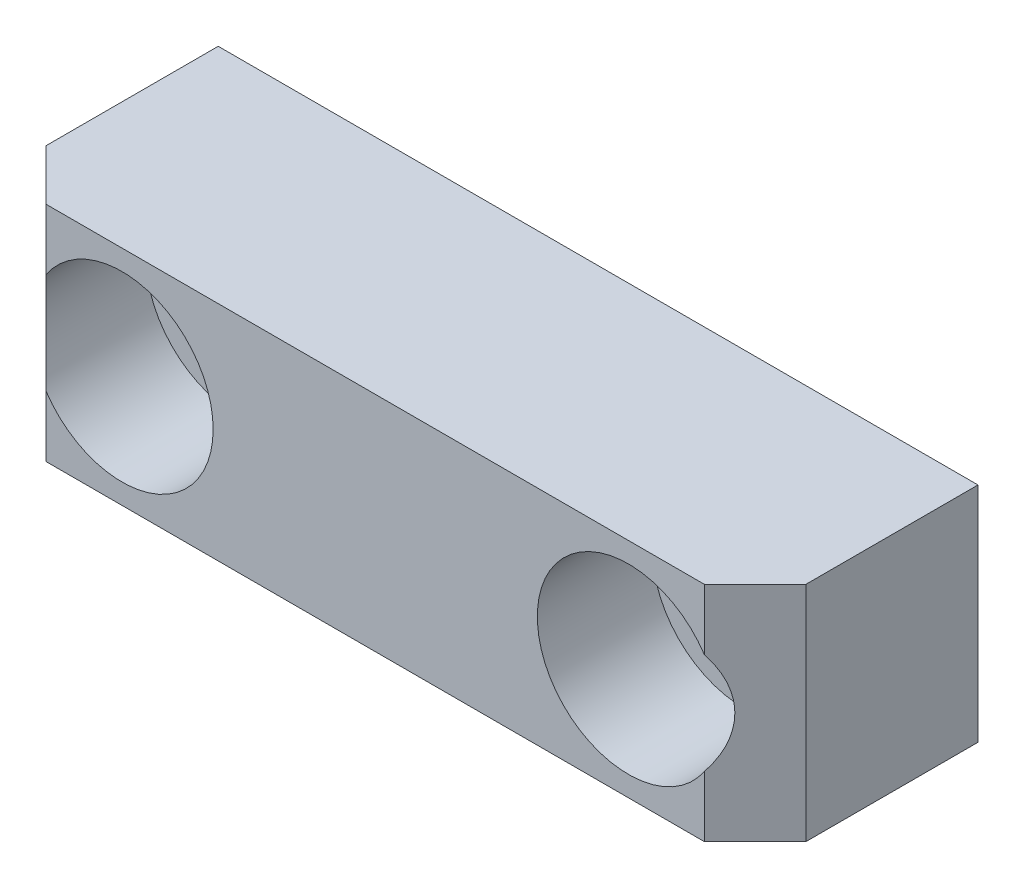
ISO-10303-21;
HEADER;
FILE_DESCRIPTION(('STEP AP214'),'2;1');
FILE_NAME('part.step','',(''),(''),'','','');
FILE_SCHEMA(('AUTOMOTIVE_DESIGN { 1 0 10303 214 1 1 1 1 }'));
ENDSEC;
DATA;
#1=APPLICATION_CONTEXT('core data for automotive mechanical design processes');
#2=APPLICATION_PROTOCOL_DEFINITION('international standard','automotive_design',2000,#1);
#3=PRODUCT_CONTEXT('',#1,'mechanical');
#4=PRODUCT('Part','Part','',(#3));
#5=PRODUCT_RELATED_PRODUCT_CATEGORY('part','',(#4));
#6=PRODUCT_DEFINITION_FORMATION('','',#4);
#7=PRODUCT_DEFINITION_CONTEXT('part definition',#1,'design');
#8=PRODUCT_DEFINITION('design','',#6,#7);
#9=PRODUCT_DEFINITION_SHAPE('','',#8);
#10=(LENGTH_UNIT() NAMED_UNIT(*) SI_UNIT(.MILLI.,.METRE.));
#11=(NAMED_UNIT(*) PLANE_ANGLE_UNIT() SI_UNIT($,.RADIAN.));
#12=(NAMED_UNIT(*) SI_UNIT($,.STERADIAN.) SOLID_ANGLE_UNIT());
#13=UNCERTAINTY_MEASURE_WITH_UNIT(LENGTH_MEASURE(1.E-05),#10,'distance_accuracy_value','');
#14=(GEOMETRIC_REPRESENTATION_CONTEXT(3) GLOBAL_UNCERTAINTY_ASSIGNED_CONTEXT((#13)) GLOBAL_UNIT_ASSIGNED_CONTEXT((#10,
#11,#12)) REPRESENTATION_CONTEXT('',''));
#15=CARTESIAN_POINT('',(0.,0.,0.));
#16=DIRECTION('',(0.,0.,1.));
#17=DIRECTION('',(1.,0.,0.));
#18=AXIS2_PLACEMENT_3D('',#15,#16,#17);
#19=CARTESIAN_POINT('',(-37.5,22.,0.));
#20=DIRECTION('',(1.,0.,0.));
#21=DIRECTION('',(0.,0.,-1.));
#22=AXIS2_PLACEMENT_3D('',#19,#20,#21);
#23=PLANE('',#22);
#24=DIRECTION('',(0.,0.,1.));
#25=VECTOR('',#24,1.);
#26=CARTESIAN_POINT('',(-37.5,0.,0.));
#27=LINE('',#26,#25);
#28=CARTESIAN_POINT('',(-37.5,0.,-22.));
#29=VERTEX_POINT('',#28);
#30=CARTESIAN_POINT('',(-37.5,0.,-5.00000000000004));
#31=VERTEX_POINT('',#30);
#32=EDGE_CURVE('E123',#29,#31,#27,.T.);
#33=ORIENTED_EDGE('',*,*,#32,.T.);
#34=DIRECTION('',(0.,1.,0.));
#35=VECTOR('',#34,1.);
#36=CARTESIAN_POINT('',(-37.5,22.,-5.00000000000004));
#37=LINE('',#36,#35);
#38=CARTESIAN_POINT('',(-37.5,22.,-5.00000000000004));
#39=VERTEX_POINT('',#38);
#40=EDGE_CURVE('E55',#31,#39,#37,.T.);
#41=ORIENTED_EDGE('',*,*,#40,.T.);
#42=DIRECTION('',(0.,0.,1.));
#43=VECTOR('',#42,1.);
#44=CARTESIAN_POINT('',(-37.5,22.,0.));
#45=LINE('',#44,#43);
#46=CARTESIAN_POINT('',(-37.5,22.,-22.));
#47=VERTEX_POINT('',#46);
#48=EDGE_CURVE('E131',#47,#39,#45,.T.);
#49=ORIENTED_EDGE('',*,*,#48,.F.);
#50=DIRECTION('',(0.,-1.,0.));
#51=VECTOR('',#50,1.);
#52=CARTESIAN_POINT('',(-37.5,22.,-22.));
#53=LINE('',#52,#51);
#54=EDGE_CURVE('E115',#47,#29,#53,.T.);
#55=ORIENTED_EDGE('',*,*,#54,.T.);
#56=EDGE_LOOP('',(#33,#41,#49,#55));
#57=FACE_BOUND('',#56,.T.);
#58=ADVANCED_FACE('F32',(#57),#23,.F.);
#59=CARTESIAN_POINT('',(-37.5,22.,0.));
#60=DIRECTION('',(0.,0.,-1.));
#61=DIRECTION('',(-1.,0.,0.));
#62=AXIS2_PLACEMENT_3D('',#59,#60,#61);
#63=PLANE('',#62);
#64=DIRECTION('',(1.,0.,0.));
#65=VECTOR('',#64,1.);
#66=CARTESIAN_POINT('',(-37.5,22.,0.));
#67=LINE('',#66,#65);
#68=CARTESIAN_POINT('',(-32.4999999999999,22.,0.));
#69=VERTEX_POINT('',#68);
#70=CARTESIAN_POINT('',(32.5,22.,0.));
#71=VERTEX_POINT('',#70);
#72=EDGE_CURVE('E105',#69,#71,#67,.T.);
#73=ORIENTED_EDGE('',*,*,#72,.F.);
#74=DIRECTION('',(0.,-1.,0.));
#75=VECTOR('',#74,1.);
#76=CARTESIAN_POINT('',(-32.4999999999999,22.,0.));
#77=LINE('',#76,#75);
#78=CARTESIAN_POINT('',(-32.4999999999999,15.9749371855332,0.));
#79=VERTEX_POINT('',#78);
#80=EDGE_CURVE('E138',#69,#79,#77,.T.);
#81=ORIENTED_EDGE('',*,*,#80,.T.);
#82=CARTESIAN_POINT('',(-25.,11.,0.));
#83=DIRECTION('',(0.,0.,1.));
#84=DIRECTION('',(1.,0.,0.));
#85=AXIS2_PLACEMENT_3D('',#82,#83,#84);
#86=CIRCLE('',#85,9.00000000000001);
#87=CARTESIAN_POINT('',(-32.4999999999999,6.02506281446675,0.));
#88=VERTEX_POINT('',#87);
#89=EDGE_CURVE('E166',#88,#79,#86,.T.);
#90=ORIENTED_EDGE('',*,*,#89,.F.);
#91=DIRECTION('',(0.,-1.,0.));
#92=VECTOR('',#91,1.);
#93=CARTESIAN_POINT('',(-32.4999999999999,22.,0.));
#94=LINE('',#93,#92);
#95=CARTESIAN_POINT('',(-32.4999999999999,0.,0.));
#96=VERTEX_POINT('',#95);
#97=EDGE_CURVE('E136',#88,#96,#94,.T.);
#98=ORIENTED_EDGE('',*,*,#97,.T.);
#99=DIRECTION('',(1.,0.,0.));
#100=VECTOR('',#99,1.);
#101=CARTESIAN_POINT('',(-37.5,0.,0.));
#102=LINE('',#101,#100);
#103=CARTESIAN_POINT('',(32.5,0.,0.));
#104=VERTEX_POINT('',#103);
#105=EDGE_CURVE('E125',#96,#104,#102,.T.);
#106=ORIENTED_EDGE('',*,*,#105,.T.);
#107=DIRECTION('',(0.,1.,0.));
#108=VECTOR('',#107,1.);
#109=CARTESIAN_POINT('',(32.5,22.,0.));
#110=LINE('',#109,#108);
#111=CARTESIAN_POINT('',(32.5,6.02506281446683,0.));
#112=VERTEX_POINT('',#111);
#113=EDGE_CURVE('E134',#104,#112,#110,.T.);
#114=ORIENTED_EDGE('',*,*,#113,.T.);
#115=CARTESIAN_POINT('',(25.,11.,0.));
#116=DIRECTION('',(0.,0.,1.));
#117=DIRECTION('',(1.,0.,0.));
#118=AXIS2_PLACEMENT_3D('',#115,#116,#117);
#119=CIRCLE('',#118,9.);
#120=CARTESIAN_POINT('',(32.5,15.9749371855332,0.));
#121=VERTEX_POINT('',#120);
#122=EDGE_CURVE('E178',#121,#112,#119,.T.);
#123=ORIENTED_EDGE('',*,*,#122,.F.);
#124=DIRECTION('',(0.,1.,0.));
#125=VECTOR('',#124,1.);
#126=CARTESIAN_POINT('',(32.5,22.,0.));
#127=LINE('',#126,#125);
#128=EDGE_CURVE('E114',#121,#71,#127,.T.);
#129=ORIENTED_EDGE('',*,*,#128,.T.);
#130=EDGE_LOOP('',(#73,#81,#90,#98,#106,#114,#123,#129));
#131=FACE_BOUND('',#130,.T.);
#132=ADVANCED_FACE('F188',(#131),#63,.F.);
#133=CARTESIAN_POINT('',(37.5,22.,0.));
#134=DIRECTION('',(-1.,0.,0.));
#135=DIRECTION('',(0.,0.,1.));
#136=AXIS2_PLACEMENT_3D('',#133,#134,#135);
#137=PLANE('',#136);
#138=DIRECTION('',(0.,0.,-1.));
#139=VECTOR('',#138,1.);
#140=CARTESIAN_POINT('',(37.5,22.,0.));
#141=LINE('',#140,#139);
#142=CARTESIAN_POINT('',(37.5,22.,-5.00000000000009));
#143=VERTEX_POINT('',#142);
#144=CARTESIAN_POINT('',(37.5,22.,-22.));
#145=VERTEX_POINT('',#144);
#146=EDGE_CURVE('E96',#143,#145,#141,.T.);
#147=ORIENTED_EDGE('',*,*,#146,.F.);
#148=DIRECTION('',(0.,-1.,0.));
#149=VECTOR('',#148,1.);
#150=CARTESIAN_POINT('',(37.5,22.,-5.00000000000009));
#151=LINE('',#150,#149);
#152=CARTESIAN_POINT('',(37.5,0.,-5.0000000000001));
#153=VERTEX_POINT('',#152);
#154=EDGE_CURVE('E40',#143,#153,#151,.T.);
#155=ORIENTED_EDGE('',*,*,#154,.T.);
#156=DIRECTION('',(0.,0.,-1.));
#157=VECTOR('',#156,1.);
#158=CARTESIAN_POINT('',(37.5,0.,0.));
#159=LINE('',#158,#157);
#160=CARTESIAN_POINT('',(37.5,0.,-22.));
#161=VERTEX_POINT('',#160);
#162=EDGE_CURVE('E111',#153,#161,#159,.T.);
#163=ORIENTED_EDGE('',*,*,#162,.T.);
#164=DIRECTION('',(0.,-1.,0.));
#165=VECTOR('',#164,1.);
#166=CARTESIAN_POINT('',(37.5,22.,-22.));
#167=LINE('',#166,#165);
#168=EDGE_CURVE('E108',#145,#161,#167,.T.);
#169=ORIENTED_EDGE('',*,*,#168,.F.);
#170=EDGE_LOOP('',(#147,#155,#163,#169));
#171=FACE_BOUND('',#170,.T.);
#172=ADVANCED_FACE('F109',(#171),#137,.F.);
#173=CARTESIAN_POINT('',(-37.5,22.,-22.));
#174=DIRECTION('',(0.,0.,1.));
#175=DIRECTION('',(1.,0.,0.));
#176=AXIS2_PLACEMENT_3D('',#173,#174,#175);
#177=PLANE('',#176);
#178=CARTESIAN_POINT('',(25.,11.,-22.));
#179=DIRECTION('',(0.,0.,1.));
#180=DIRECTION('',(1.,0.,0.));
#181=AXIS2_PLACEMENT_3D('',#178,#179,#180);
#182=CIRCLE('',#181,5.99999999999999);
#183=CARTESIAN_POINT('',(31.,11.,-22.));
#184=VERTEX_POINT('',#183);
#185=EDGE_CURVE('E169',#184,#184,#182,.T.);
#186=ORIENTED_EDGE('',*,*,#185,.T.);
#187=EDGE_LOOP('',(#186));
#188=FACE_BOUND('',#187,.T.);
#189=CARTESIAN_POINT('',(-25.,11.,-22.));
#190=DIRECTION('',(0.,0.,1.));
#191=DIRECTION('',(1.,0.,0.));
#192=AXIS2_PLACEMENT_3D('',#189,#190,#191);
#193=CIRCLE('',#192,5.99999999999999);
#194=CARTESIAN_POINT('',(-19.,11.,-22.));
#195=VERTEX_POINT('',#194);
#196=EDGE_CURVE('E126',#195,#195,#193,.T.);
#197=ORIENTED_EDGE('',*,*,#196,.T.);
#198=EDGE_LOOP('',(#197));
#199=FACE_BOUND('',#198,.T.);
#200=DIRECTION('',(-1.,0.,0.));
#201=VECTOR('',#200,1.);
#202=CARTESIAN_POINT('',(-37.5,0.,-22.));
#203=LINE('',#202,#201);
#204=EDGE_CURVE('E130',#161,#29,#203,.T.);
#205=ORIENTED_EDGE('',*,*,#204,.T.);
#206=ORIENTED_EDGE('',*,*,#54,.F.);
#207=DIRECTION('',(-1.,0.,0.));
#208=VECTOR('',#207,1.);
#209=CARTESIAN_POINT('',(-37.5,22.,-22.));
#210=LINE('',#209,#208);
#211=EDGE_CURVE('E100',#145,#47,#210,.T.);
#212=ORIENTED_EDGE('',*,*,#211,.F.);
#213=ORIENTED_EDGE('',*,*,#168,.T.);
#214=EDGE_LOOP('',(#205,#206,#212,#213));
#215=FACE_BOUND('',#214,.T.);
#216=ADVANCED_FACE('F117',(#188,#199,#215),#177,.F.);
#217=CARTESIAN_POINT('',(-37.5,22.,-22.));
#218=DIRECTION('',(0.,-1.,0.));
#219=DIRECTION('',(0.,0.,-1.));
#220=AXIS2_PLACEMENT_3D('',#217,#218,#219);
#221=PLANE('',#220);
#222=ORIENTED_EDGE('',*,*,#48,.T.);
#223=DIRECTION('',(-0.707106781186551,0.,-0.707106781186544));
#224=VECTOR('',#223,1.);
#225=CARTESIAN_POINT('',(-32.4999999999999,22.,0.));
#226=LINE('',#225,#224);
#227=EDGE_CURVE('E149',#39,#69,#226,.F.);
#228=ORIENTED_EDGE('',*,*,#227,.T.);
#229=ORIENTED_EDGE('',*,*,#72,.T.);
#230=DIRECTION('',(-0.707106781186545,0.,0.70710678118655));
#231=VECTOR('',#230,1.);
#232=CARTESIAN_POINT('',(37.5,22.,-5.00000000000009));
#233=LINE('',#232,#231);
#234=EDGE_CURVE('E47',#71,#143,#233,.F.);
#235=ORIENTED_EDGE('',*,*,#234,.T.);
#236=ORIENTED_EDGE('',*,*,#146,.T.);
#237=ORIENTED_EDGE('',*,*,#211,.T.);
#238=EDGE_LOOP('',(#222,#228,#229,#235,#236,#237));
#239=FACE_BOUND('',#238,.T.);
#240=ADVANCED_FACE('F98',(#239),#221,.F.);
#241=CARTESIAN_POINT('',(-37.5,0.,-22.));
#242=DIRECTION('',(0.,-1.,0.));
#243=DIRECTION('',(0.,0.,-1.));
#244=AXIS2_PLACEMENT_3D('',#241,#242,#243);
#245=PLANE('',#244);
#246=ORIENTED_EDGE('',*,*,#105,.F.);
#247=DIRECTION('',(0.707106781186551,0.,0.707106781186544));
#248=VECTOR('',#247,1.);
#249=CARTESIAN_POINT('',(-46.,0.,-13.4999999999999));
#250=LINE('',#249,#248);
#251=EDGE_CURVE('E145',#96,#31,#250,.F.);
#252=ORIENTED_EDGE('',*,*,#251,.T.);
#253=ORIENTED_EDGE('',*,*,#32,.F.);
#254=ORIENTED_EDGE('',*,*,#204,.F.);
#255=ORIENTED_EDGE('',*,*,#162,.F.);
#256=DIRECTION('',(0.707106781186545,0.,-0.70710678118655));
#257=VECTOR('',#256,1.);
#258=CARTESIAN_POINT('',(8.50000000000026,0.,23.9999999999999));
#259=LINE('',#258,#257);
#260=EDGE_CURVE('E143',#153,#104,#259,.F.);
#261=ORIENTED_EDGE('',*,*,#260,.T.);
#262=EDGE_LOOP('',(#246,#252,#253,#254,#255,#261));
#263=FACE_BOUND('',#262,.T.);
#264=ADVANCED_FACE('F153',(#263),#245,.T.);
#265=CARTESIAN_POINT('',(-25.,11.,0.));
#266=DIRECTION('',(0.,0.,1.));
#267=DIRECTION('',(1.,0.,0.));
#268=AXIS2_PLACEMENT_3D('',#265,#266,#267);
#269=CYLINDRICAL_SURFACE('',#268,6.);
#270=ORIENTED_EDGE('',*,*,#196,.F.);
#271=EDGE_LOOP('',(#270));
#272=FACE_BOUND('',#271,.T.);
#273=CARTESIAN_POINT('',(-25.,11.,-11.366));
#274=DIRECTION('',(0.,0.,1.));
#275=DIRECTION('',(1.,0.,0.));
#276=AXIS2_PLACEMENT_3D('',#273,#274,#275);
#277=CIRCLE('',#276,6.);
#278=CARTESIAN_POINT('',(-19.,11.,-11.366));
#279=VERTEX_POINT('',#278);
#280=EDGE_CURVE('E160',#279,#279,#277,.T.);
#281=ORIENTED_EDGE('',*,*,#280,.T.);
#282=EDGE_LOOP('',(#281));
#283=FACE_BOUND('',#282,.T.);
#284=ADVANCED_FACE('F209',(#272,#283),#269,.F.);
#285=CARTESIAN_POINT('',(-19.,11.,-11.366));
#286=DIRECTION('',(0.,0.,-1.));
#287=DIRECTION('',(-1.,0.,0.));
#288=AXIS2_PLACEMENT_3D('',#285,#286,#287);
#289=PLANE('',#288);
#290=ORIENTED_EDGE('',*,*,#280,.F.);
#291=EDGE_LOOP('',(#290));
#292=FACE_BOUND('',#291,.T.);
#293=CARTESIAN_POINT('',(-25.,11.,-11.366));
#294=DIRECTION('',(0.,0.,1.));
#295=DIRECTION('',(1.,0.,0.));
#296=AXIS2_PLACEMENT_3D('',#293,#294,#295);
#297=CIRCLE('',#296,9.);
#298=CARTESIAN_POINT('',(-16.,11.,-11.366));
#299=VERTEX_POINT('',#298);
#300=EDGE_CURVE('E163',#299,#299,#297,.T.);
#301=ORIENTED_EDGE('',*,*,#300,.T.);
#302=EDGE_LOOP('',(#301));
#303=FACE_BOUND('',#302,.T.);
#304=ADVANCED_FACE('F199',(#292,#303),#289,.F.);
#305=CARTESIAN_POINT('',(-25.,11.,0.));
#306=DIRECTION('',(0.,0.,1.));
#307=DIRECTION('',(1.,0.,0.));
#308=AXIS2_PLACEMENT_3D('',#305,#306,#307);
#309=CYLINDRICAL_SURFACE('',#308,9.);
#310=ORIENTED_EDGE('',*,*,#300,.F.);
#311=EDGE_LOOP('',(#310));
#312=FACE_BOUND('',#311,.T.);
#313=ORIENTED_EDGE('',*,*,#89,.T.);
#314=CARTESIAN_POINT('',(-25.,11.,7.49999999999983));
#315=DIRECTION('',(0.707106781186544,0.,-0.707106781186551));
#316=DIRECTION('',(0.707106781186551,0.,0.707106781186544));
#317=AXIS2_PLACEMENT_3D('',#314,#315,#316);
#318=ELLIPSE('',#317,12.7279220613578,9.);
#319=EDGE_CURVE('E141',#79,#88,#318,.F.);
#320=ORIENTED_EDGE('',*,*,#319,.T.);
#321=EDGE_LOOP('',(#313,#320));
#322=FACE_BOUND('',#321,.T.);
#323=ADVANCED_FACE('F196',(#312,#322),#309,.F.);
#324=CARTESIAN_POINT('',(25.,11.,0.));
#325=DIRECTION('',(0.,0.,1.));
#326=DIRECTION('',(1.,0.,0.));
#327=AXIS2_PLACEMENT_3D('',#324,#325,#326);
#328=CYLINDRICAL_SURFACE('',#327,6.);
#329=ORIENTED_EDGE('',*,*,#185,.F.);
#330=EDGE_LOOP('',(#329));
#331=FACE_BOUND('',#330,.T.);
#332=CARTESIAN_POINT('',(25.,11.,-11.366));
#333=DIRECTION('',(0.,0.,1.));
#334=DIRECTION('',(1.,0.,0.));
#335=AXIS2_PLACEMENT_3D('',#332,#333,#334);
#336=CIRCLE('',#335,6.);
#337=CARTESIAN_POINT('',(31.,11.,-11.366));
#338=VERTEX_POINT('',#337);
#339=EDGE_CURVE('E172',#338,#338,#336,.T.);
#340=ORIENTED_EDGE('',*,*,#339,.T.);
#341=EDGE_LOOP('',(#340));
#342=FACE_BOUND('',#341,.T.);
#343=ADVANCED_FACE('F198',(#331,#342),#328,.F.);
#344=CARTESIAN_POINT('',(31.,11.,-11.366));
#345=DIRECTION('',(0.,0.,-1.));
#346=DIRECTION('',(-1.,0.,0.));
#347=AXIS2_PLACEMENT_3D('',#344,#345,#346);
#348=PLANE('',#347);
#349=ORIENTED_EDGE('',*,*,#339,.F.);
#350=EDGE_LOOP('',(#349));
#351=FACE_BOUND('',#350,.T.);
#352=CARTESIAN_POINT('',(25.,11.,-11.366));
#353=DIRECTION('',(0.,0.,1.));
#354=DIRECTION('',(1.,0.,0.));
#355=AXIS2_PLACEMENT_3D('',#352,#353,#354);
#356=CIRCLE('',#355,9.);
#357=CARTESIAN_POINT('',(34.,11.,-11.366));
#358=VERTEX_POINT('',#357);
#359=EDGE_CURVE('E175',#358,#358,#356,.T.);
#360=ORIENTED_EDGE('',*,*,#359,.T.);
#361=EDGE_LOOP('',(#360));
#362=FACE_BOUND('',#361,.T.);
#363=ADVANCED_FACE('F206',(#351,#362),#348,.F.);
#364=CARTESIAN_POINT('',(25.,11.,0.));
#365=DIRECTION('',(0.,0.,1.));
#366=DIRECTION('',(1.,0.,0.));
#367=AXIS2_PLACEMENT_3D('',#364,#365,#366);
#368=CYLINDRICAL_SURFACE('',#367,9.);
#369=ORIENTED_EDGE('',*,*,#359,.F.);
#370=EDGE_LOOP('',(#369));
#371=FACE_BOUND('',#370,.T.);
#372=ORIENTED_EDGE('',*,*,#122,.T.);
#373=CARTESIAN_POINT('',(25.,11.,7.50000000000001));
#374=DIRECTION('',(-0.70710678118655,0.,-0.707106781186545));
#375=DIRECTION('',(-0.707106781186545,0.,0.70710678118655));
#376=AXIS2_PLACEMENT_3D('',#373,#374,#375);
#377=ELLIPSE('',#376,12.7279220613579,9.);
#378=EDGE_CURVE('E11',#112,#121,#377,.F.);
#379=ORIENTED_EDGE('',*,*,#378,.T.);
#380=EDGE_LOOP('',(#372,#379));
#381=FACE_BOUND('',#380,.T.);
#382=ADVANCED_FACE('F183',(#371,#381),#368,.F.);
#383=CARTESIAN_POINT('',(-32.4999999999999,22.,0.));
#384=DIRECTION('',(0.707106781186544,0.,-0.707106781186551));
#385=DIRECTION('',(-0.707106781186551,0.,-0.707106781186544));
#386=AXIS2_PLACEMENT_3D('',#383,#384,#385);
#387=PLANE('',#386);
#388=ORIENTED_EDGE('',*,*,#227,.F.);
#389=ORIENTED_EDGE('',*,*,#40,.F.);
#390=ORIENTED_EDGE('',*,*,#251,.F.);
#391=ORIENTED_EDGE('',*,*,#97,.F.);
#392=ORIENTED_EDGE('',*,*,#319,.F.);
#393=ORIENTED_EDGE('',*,*,#80,.F.);
#394=EDGE_LOOP('',(#388,#389,#390,#391,#392,#393));
#395=FACE_BOUND('',#394,.T.);
#396=ADVANCED_FACE('F191',(#395),#387,.F.);
#397=CARTESIAN_POINT('',(37.5,22.,-5.00000000000009));
#398=DIRECTION('',(-0.70710678118655,0.,-0.707106781186545));
#399=DIRECTION('',(-0.707106781186545,0.,0.70710678118655));
#400=AXIS2_PLACEMENT_3D('',#397,#398,#399);
#401=PLANE('',#400);
#402=ORIENTED_EDGE('',*,*,#378,.F.);
#403=ORIENTED_EDGE('',*,*,#113,.F.);
#404=ORIENTED_EDGE('',*,*,#260,.F.);
#405=ORIENTED_EDGE('',*,*,#154,.F.);
#406=ORIENTED_EDGE('',*,*,#234,.F.);
#407=ORIENTED_EDGE('',*,*,#128,.F.);
#408=EDGE_LOOP('',(#402,#403,#404,#405,#406,#407));
#409=FACE_BOUND('',#408,.T.);
#410=ADVANCED_FACE('F34',(#409),#401,.F.);
#411=CLOSED_SHELL('',(#58,#132,#172,#216,#240,#264,#284,#304,#323,#343,#363,#382,#396,#410));
#412=MANIFOLD_SOLID_BREP('B2',#411);
#413=ADVANCED_BREP_SHAPE_REPRESENTATION('',(#18,#412),#14);
#414=SHAPE_DEFINITION_REPRESENTATION(#9,#413);
ENDSEC;
END-ISO-10303-21;
